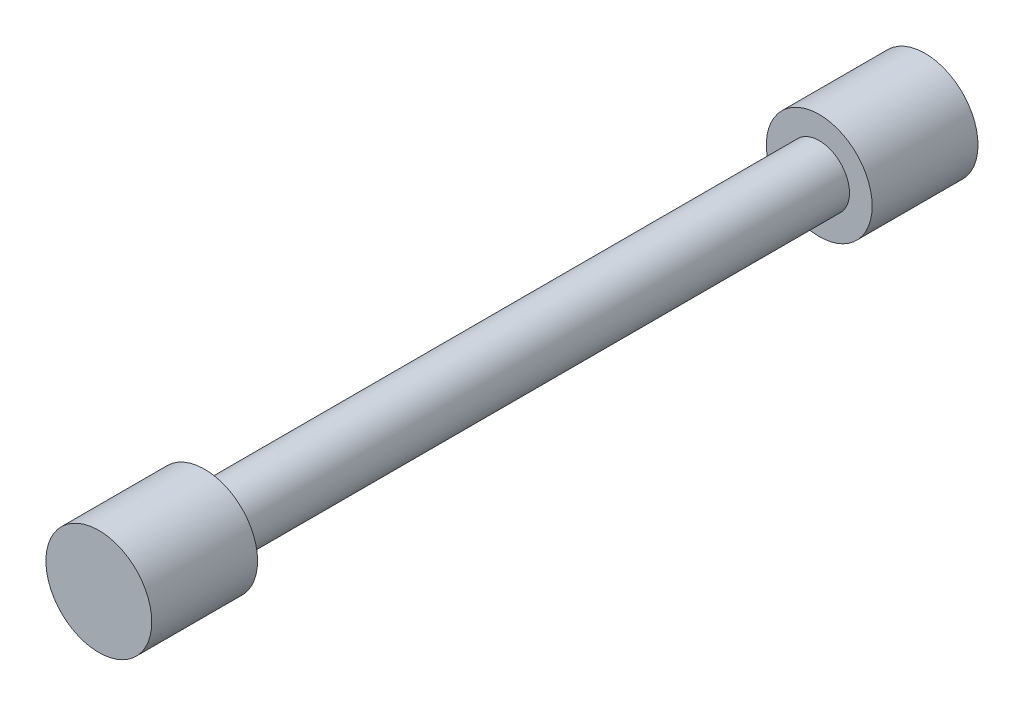
ISO-10303-21;
HEADER;
FILE_DESCRIPTION(('STEP AP214'),'2;1');
FILE_NAME('part.step','',(''),(''),'','','');
FILE_SCHEMA(('AUTOMOTIVE_DESIGN { 1 0 10303 214 1 1 1 1 }'));
ENDSEC;
DATA;
#1=APPLICATION_CONTEXT('core data for automotive mechanical design processes');
#2=APPLICATION_PROTOCOL_DEFINITION('international standard','automotive_design',2000,#1);
#3=PRODUCT_CONTEXT('',#1,'mechanical');
#4=PRODUCT('Part','Part','',(#3));
#5=PRODUCT_RELATED_PRODUCT_CATEGORY('part','',(#4));
#6=PRODUCT_DEFINITION_FORMATION('','',#4);
#7=PRODUCT_DEFINITION_CONTEXT('part definition',#1,'design');
#8=PRODUCT_DEFINITION('design','',#6,#7);
#9=PRODUCT_DEFINITION_SHAPE('','',#8);
#10=(LENGTH_UNIT() NAMED_UNIT(*) SI_UNIT(.MILLI.,.METRE.));
#11=(NAMED_UNIT(*) PLANE_ANGLE_UNIT() SI_UNIT($,.RADIAN.));
#12=(NAMED_UNIT(*) SI_UNIT($,.STERADIAN.) SOLID_ANGLE_UNIT());
#13=UNCERTAINTY_MEASURE_WITH_UNIT(LENGTH_MEASURE(1.E-05),#10,'distance_accuracy_value','');
#14=(GEOMETRIC_REPRESENTATION_CONTEXT(3) GLOBAL_UNCERTAINTY_ASSIGNED_CONTEXT((#13)) GLOBAL_UNIT_ASSIGNED_CONTEXT((#10,
#11,#12)) REPRESENTATION_CONTEXT('',''));
#15=CARTESIAN_POINT('',(0.,0.,0.));
#16=DIRECTION('',(0.,0.,1.));
#17=DIRECTION('',(1.,0.,0.));
#18=AXIS2_PLACEMENT_3D('',#15,#16,#17);
#19=CARTESIAN_POINT('',(0.,0.,7.));
#20=DIRECTION('',(0.,0.,1.));
#21=DIRECTION('',(1.,0.,0.));
#22=AXIS2_PLACEMENT_3D('',#19,#20,#21);
#23=PLANE('',#22);
#24=CARTESIAN_POINT('',(0.,0.,7.));
#25=DIRECTION('',(0.,0.,1.));
#26=DIRECTION('',(1.,0.,0.));
#27=AXIS2_PLACEMENT_3D('',#24,#25,#26);
#28=CIRCLE('',#27,7.);
#29=CARTESIAN_POINT('',(7.,0.,7.));
#30=VERTEX_POINT('',#29);
#31=EDGE_CURVE('E10',#30,#30,#28,.T.);
#32=ORIENTED_EDGE('',*,*,#31,.T.);
#33=EDGE_LOOP('',(#32));
#34=FACE_BOUND('',#33,.T.);
#35=ADVANCED_FACE('F36',(#34),#23,.T.);
#36=CARTESIAN_POINT('',(0.,0.,10.));
#37=DIRECTION('',(0.,0.,1.));
#38=DIRECTION('',(1.,0.,0.));
#39=AXIS2_PLACEMENT_3D('',#36,#37,#38);
#40=CYLINDRICAL_SURFACE('',#39,7.);
#41=CARTESIAN_POINT('',(0.,0.,-7.));
#42=DIRECTION('',(0.,0.,1.));
#43=DIRECTION('',(1.,0.,0.));
#44=AXIS2_PLACEMENT_3D('',#41,#42,#43);
#45=CIRCLE('',#44,7.);
#46=CARTESIAN_POINT('',(7.,0.,-7.));
#47=VERTEX_POINT('',#46);
#48=EDGE_CURVE('E42',#47,#47,#45,.T.);
#49=ORIENTED_EDGE('',*,*,#48,.T.);
#50=EDGE_LOOP('',(#49));
#51=FACE_BOUND('',#50,.T.);
#52=ORIENTED_EDGE('',*,*,#31,.F.);
#53=EDGE_LOOP('',(#52));
#54=FACE_BOUND('',#53,.T.);
#55=ADVANCED_FACE('F78',(#51,#54),#40,.T.);
#56=CARTESIAN_POINT('',(7.,0.,-7.));
#57=DIRECTION('',(0.,0.,-1.));
#58=DIRECTION('',(-1.,0.,0.));
#59=AXIS2_PLACEMENT_3D('',#56,#57,#58);
#60=PLANE('',#59);
#61=CARTESIAN_POINT('',(0.,0.,-7.));
#62=DIRECTION('',(0.,0.,1.));
#63=DIRECTION('',(1.,0.,0.));
#64=AXIS2_PLACEMENT_3D('',#61,#62,#63);
#65=CIRCLE('',#64,4.);
#66=CARTESIAN_POINT('',(4.,0.,-7.));
#67=VERTEX_POINT('',#66);
#68=EDGE_CURVE('E48',#67,#67,#65,.T.);
#69=ORIENTED_EDGE('',*,*,#68,.T.);
#70=EDGE_LOOP('',(#69));
#71=FACE_BOUND('',#70,.T.);
#72=ORIENTED_EDGE('',*,*,#48,.F.);
#73=EDGE_LOOP('',(#72));
#74=FACE_BOUND('',#73,.T.);
#75=ADVANCED_FACE('F79',(#71,#74),#60,.T.);
#76=CARTESIAN_POINT('',(0.,0.,10.));
#77=DIRECTION('',(0.,0.,1.));
#78=DIRECTION('',(1.,0.,0.));
#79=AXIS2_PLACEMENT_3D('',#76,#77,#78);
#80=CYLINDRICAL_SURFACE('',#79,4.);
#81=CARTESIAN_POINT('',(0.,0.,-88.2890339965728));
#82=DIRECTION('',(0.,0.,1.));
#83=DIRECTION('',(1.,0.,0.));
#84=AXIS2_PLACEMENT_3D('',#81,#82,#83);
#85=CIRCLE('',#84,4.);
#86=CARTESIAN_POINT('',(4.,0.,-88.2890339965728));
#87=VERTEX_POINT('',#86);
#88=EDGE_CURVE('E55',#87,#87,#85,.T.);
#89=ORIENTED_EDGE('',*,*,#88,.T.);
#90=EDGE_LOOP('',(#89));
#91=FACE_BOUND('',#90,.T.);
#92=ORIENTED_EDGE('',*,*,#68,.F.);
#93=EDGE_LOOP('',(#92));
#94=FACE_BOUND('',#93,.T.);
#95=ADVANCED_FACE('F84',(#91,#94),#80,.T.);
#96=CARTESIAN_POINT('',(4.,0.,-88.2890339965728));
#97=DIRECTION('',(0.,0.,1.));
#98=DIRECTION('',(1.,0.,0.));
#99=AXIS2_PLACEMENT_3D('',#96,#97,#98);
#100=PLANE('',#99);
#101=CARTESIAN_POINT('',(0.,0.,-88.2890339965728));
#102=DIRECTION('',(0.,0.,1.));
#103=DIRECTION('',(1.,0.,0.));
#104=AXIS2_PLACEMENT_3D('',#101,#102,#103);
#105=CIRCLE('',#104,7.);
#106=CARTESIAN_POINT('',(7.,0.,-88.2890339965728));
#107=VERTEX_POINT('',#106);
#108=EDGE_CURVE('E60',#107,#107,#105,.T.);
#109=ORIENTED_EDGE('',*,*,#108,.T.);
#110=EDGE_LOOP('',(#109));
#111=FACE_BOUND('',#110,.T.);
#112=ORIENTED_EDGE('',*,*,#88,.F.);
#113=EDGE_LOOP('',(#112));
#114=FACE_BOUND('',#113,.T.);
#115=ADVANCED_FACE('F75',(#111,#114),#100,.T.);
#116=CARTESIAN_POINT('',(0.,0.,10.));
#117=DIRECTION('',(0.,0.,1.));
#118=DIRECTION('',(1.,0.,0.));
#119=AXIS2_PLACEMENT_3D('',#116,#117,#118);
#120=CYLINDRICAL_SURFACE('',#119,7.);
#121=CARTESIAN_POINT('',(0.,0.,-102.289033996573));
#122=DIRECTION('',(0.,0.,1.));
#123=DIRECTION('',(1.,0.,0.));
#124=AXIS2_PLACEMENT_3D('',#121,#122,#123);
#125=CIRCLE('',#124,7.);
#126=CARTESIAN_POINT('',(7.,0.,-102.289033996573));
#127=VERTEX_POINT('',#126);
#128=EDGE_CURVE('E58',#127,#127,#125,.T.);
#129=ORIENTED_EDGE('',*,*,#128,.T.);
#130=EDGE_LOOP('',(#129));
#131=FACE_BOUND('',#130,.T.);
#132=ORIENTED_EDGE('',*,*,#108,.F.);
#133=EDGE_LOOP('',(#132));
#134=FACE_BOUND('',#133,.T.);
#135=ADVANCED_FACE('F64',(#131,#134),#120,.T.);
#136=CARTESIAN_POINT('',(7.,0.,-102.289033996573));
#137=DIRECTION('',(0.,0.,-1.));
#138=DIRECTION('',(-1.,0.,0.));
#139=AXIS2_PLACEMENT_3D('',#136,#137,#138);
#140=PLANE('',#139);
#141=ORIENTED_EDGE('',*,*,#128,.F.);
#142=EDGE_LOOP('',(#141));
#143=FACE_BOUND('',#142,.T.);
#144=ADVANCED_FACE('F70',(#143),#140,.T.);
#145=CLOSED_SHELL('',(#35,#55,#75,#95,#115,#135,#144));
#146=MANIFOLD_SOLID_BREP('B2',#145);
#147=ADVANCED_BREP_SHAPE_REPRESENTATION('',(#18,#146),#14);
#148=SHAPE_DEFINITION_REPRESENTATION(#9,#147);
ENDSEC;
END-ISO-10303-21;
